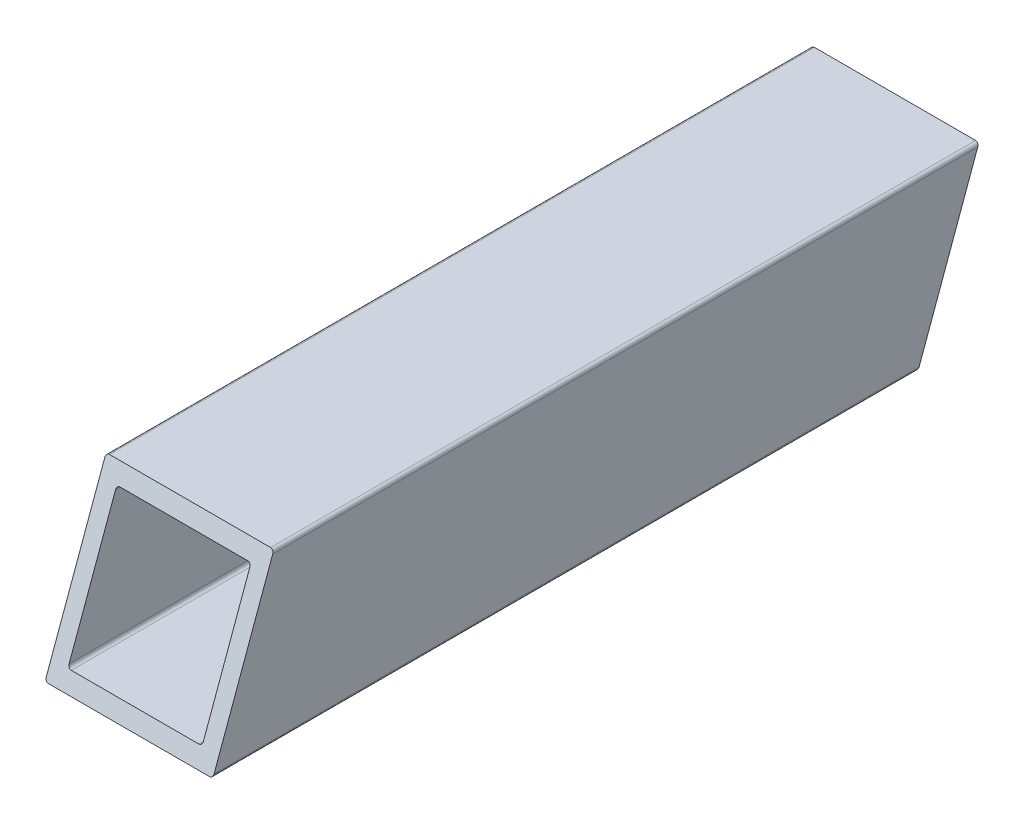
ISO-10303-21;
HEADER;
FILE_DESCRIPTION(('STEP AP214'),'2;1');
FILE_NAME('part.step','',(''),(''),'','','');
FILE_SCHEMA(('AUTOMOTIVE_DESIGN { 1 0 10303 214 1 1 1 1 }'));
ENDSEC;
DATA;
#1=APPLICATION_CONTEXT('core data for automotive mechanical design processes');
#2=APPLICATION_PROTOCOL_DEFINITION('international standard','automotive_design',2000,#1);
#3=PRODUCT_CONTEXT('',#1,'mechanical');
#4=PRODUCT('Part','Part','',(#3));
#5=PRODUCT_RELATED_PRODUCT_CATEGORY('part','',(#4));
#6=PRODUCT_DEFINITION_FORMATION('','',#4);
#7=PRODUCT_DEFINITION_CONTEXT('part definition',#1,'design');
#8=PRODUCT_DEFINITION('design','',#6,#7);
#9=PRODUCT_DEFINITION_SHAPE('','',#8);
#10=(LENGTH_UNIT() NAMED_UNIT(*) SI_UNIT(.MILLI.,.METRE.));
#11=(NAMED_UNIT(*) PLANE_ANGLE_UNIT() SI_UNIT($,.RADIAN.));
#12=(NAMED_UNIT(*) SI_UNIT($,.STERADIAN.) SOLID_ANGLE_UNIT());
#13=UNCERTAINTY_MEASURE_WITH_UNIT(LENGTH_MEASURE(1.E-05),#10,'distance_accuracy_value','');
#14=(GEOMETRIC_REPRESENTATION_CONTEXT(3) GLOBAL_UNCERTAINTY_ASSIGNED_CONTEXT((#13)) GLOBAL_UNIT_ASSIGNED_CONTEXT((#10,
#11,#12)) REPRESENTATION_CONTEXT('',''));
#15=CARTESIAN_POINT('',(0.,0.,0.));
#16=DIRECTION('',(0.,0.,1.));
#17=DIRECTION('',(1.,0.,0.));
#18=AXIS2_PLACEMENT_3D('',#15,#16,#17);
#19=CARTESIAN_POINT('',(-5.,5.,200.));
#20=DIRECTION('',(1.,0.,0.));
#21=DIRECTION('',(0.,1.,0.));
#22=AXIS2_PLACEMENT_3D('',#19,#20,#21);
#23=PLANE('',#22);
#24=DIRECTION('',(0.,0.,-1.));
#25=VECTOR('',#24,1.);
#26=CARTESIAN_POINT('',(-5.,-4.8,200.));
#27=LINE('',#26,#25);
#28=CARTESIAN_POINT('',(-5.,-4.8,3.56690829580883));
#29=VERTEX_POINT('',#28);
#30=CARTESIAN_POINT('',(-5.,-4.8,45.5669082958088));
#31=VERTEX_POINT('',#30);
#32=EDGE_CURVE('E275',#29,#31,#27,.F.);
#33=ORIENTED_EDGE('',*,*,#32,.T.);
#34=DIRECTION('',(0.,0.939692620785909,-0.342020143325668));
#35=VECTOR('',#34,1.);
#36=CARTESIAN_POINT('',(-5.,-5.,45.6397023426621));
#37=LINE('',#36,#35);
#38=CARTESIAN_POINT('',(-5.,4.8,42.0727940468533));
#39=VERTEX_POINT('',#38);
#40=EDGE_CURVE('E163',#31,#39,#37,.T.);
#41=ORIENTED_EDGE('',*,*,#40,.T.);
#42=DIRECTION('',(0.,0.,-1.));
#43=VECTOR('',#42,1.);
#44=CARTESIAN_POINT('',(-5.,4.8,200.));
#45=LINE('',#44,#43);
#46=CARTESIAN_POINT('',(-5.,4.8,0.0727940468532356));
#47=VERTEX_POINT('',#46);
#48=EDGE_CURVE('E273',#39,#47,#45,.T.);
#49=ORIENTED_EDGE('',*,*,#48,.T.);
#50=DIRECTION('',(0.,-0.939692620785907,0.342020143325673));
#51=VECTOR('',#50,1.);
#52=CARTESIAN_POINT('',(-5.,-5.,3.63970234266207));
#53=LINE('',#52,#51);
#54=EDGE_CURVE('E187',#47,#29,#53,.T.);
#55=ORIENTED_EDGE('',*,*,#54,.T.);
#56=EDGE_LOOP('',(#33,#41,#49,#55));
#57=FACE_BOUND('',#56,.T.);
#58=ADVANCED_FACE('F34',(#57),#23,.F.);
#59=CARTESIAN_POINT('',(-5.,-5.,200.));
#60=DIRECTION('',(0.,1.,0.));
#61=DIRECTION('',(-1.,0.,0.));
#62=AXIS2_PLACEMENT_3D('',#59,#60,#61);
#63=PLANE('',#62);
#64=DIRECTION('',(0.,0.,-1.));
#65=VECTOR('',#64,1.);
#66=CARTESIAN_POINT('',(4.8,-5.,200.));
#67=LINE('',#66,#65);
#68=CARTESIAN_POINT('',(4.8,-5.,3.63970234266207));
#69=VERTEX_POINT('',#68);
#70=CARTESIAN_POINT('',(4.8,-5.,45.6397023426621));
#71=VERTEX_POINT('',#70);
#72=EDGE_CURVE('E269',#69,#71,#67,.F.);
#73=ORIENTED_EDGE('',*,*,#72,.T.);
#74=DIRECTION('',(1.,0.,0.));
#75=VECTOR('',#74,1.);
#76=CARTESIAN_POINT('',(-5.,-5.,45.6397023426621));
#77=LINE('',#76,#75);
#78=CARTESIAN_POINT('',(-4.8,-5.,45.6397023426621));
#79=VERTEX_POINT('',#78);
#80=EDGE_CURVE('E147',#79,#71,#77,.T.);
#81=ORIENTED_EDGE('',*,*,#80,.F.);
#82=DIRECTION('',(0.,0.,-1.));
#83=VECTOR('',#82,1.);
#84=CARTESIAN_POINT('',(-4.8,-5.,200.));
#85=LINE('',#84,#83);
#86=CARTESIAN_POINT('',(-4.8,-5.,3.63970234266207));
#87=VERTEX_POINT('',#86);
#88=EDGE_CURVE('E271',#79,#87,#85,.T.);
#89=ORIENTED_EDGE('',*,*,#88,.T.);
#90=DIRECTION('',(1.,0.,0.));
#91=VECTOR('',#90,1.);
#92=CARTESIAN_POINT('',(-5.,-5.,3.63970234266207));
#93=LINE('',#92,#91);
#94=EDGE_CURVE('E220',#87,#69,#93,.T.);
#95=ORIENTED_EDGE('',*,*,#94,.T.);
#96=EDGE_LOOP('',(#73,#81,#89,#95));
#97=FACE_BOUND('',#96,.T.);
#98=ADVANCED_FACE('F318',(#97),#63,.F.);
#99=CARTESIAN_POINT('',(5.,5.,200.));
#100=DIRECTION('',(-1.,0.,0.));
#101=DIRECTION('',(0.,-1.,0.));
#102=AXIS2_PLACEMENT_3D('',#99,#100,#101);
#103=PLANE('',#102);
#104=DIRECTION('',(0.,0.,-1.));
#105=VECTOR('',#104,1.);
#106=CARTESIAN_POINT('',(5.,4.8,200.));
#107=LINE('',#106,#105);
#108=CARTESIAN_POINT('',(5.,4.8,0.0727940468532356));
#109=VERTEX_POINT('',#108);
#110=CARTESIAN_POINT('',(5.,4.8,42.0727940468533));
#111=VERTEX_POINT('',#110);
#112=EDGE_CURVE('E162',#109,#111,#107,.F.);
#113=ORIENTED_EDGE('',*,*,#112,.T.);
#114=DIRECTION('',(0.,0.939692620785909,-0.342020143325668));
#115=VECTOR('',#114,1.);
#116=CARTESIAN_POINT('',(5.,-5.,45.6397023426621));
#117=LINE('',#116,#115);
#118=CARTESIAN_POINT('',(5.,-4.8,45.5669082958088));
#119=VERTEX_POINT('',#118);
#120=EDGE_CURVE('E56',#119,#111,#117,.T.);
#121=ORIENTED_EDGE('',*,*,#120,.F.);
#122=DIRECTION('',(0.,0.,-1.));
#123=VECTOR('',#122,1.);
#124=CARTESIAN_POINT('',(5.,-4.8,200.));
#125=LINE('',#124,#123);
#126=CARTESIAN_POINT('',(5.,-4.8,3.56690829580883));
#127=VERTEX_POINT('',#126);
#128=EDGE_CURVE('E159',#119,#127,#125,.T.);
#129=ORIENTED_EDGE('',*,*,#128,.T.);
#130=DIRECTION('',(0.,-0.939692620785907,0.342020143325673));
#131=VECTOR('',#130,1.);
#132=CARTESIAN_POINT('',(5.,-5.,3.63970234266207));
#133=LINE('',#132,#131);
#134=EDGE_CURVE('E182',#109,#127,#133,.T.);
#135=ORIENTED_EDGE('',*,*,#134,.F.);
#136=EDGE_LOOP('',(#113,#121,#129,#135));
#137=FACE_BOUND('',#136,.T.);
#138=ADVANCED_FACE('F157',(#137),#103,.F.);
#139=CARTESIAN_POINT('',(-5.,5.,200.));
#140=DIRECTION('',(0.,-1.,0.));
#141=DIRECTION('',(1.,0.,0.));
#142=AXIS2_PLACEMENT_3D('',#139,#140,#141);
#143=PLANE('',#142);
#144=DIRECTION('',(0.,0.,-1.));
#145=VECTOR('',#144,1.);
#146=CARTESIAN_POINT('',(-4.8,5.,200.));
#147=LINE('',#146,#145);
#148=CARTESIAN_POINT('',(-4.8,5.,0.));
#149=VERTEX_POINT('',#148);
#150=CARTESIAN_POINT('',(-4.8,5.,42.0000000000001));
#151=VERTEX_POINT('',#150);
#152=EDGE_CURVE('E170',#149,#151,#147,.F.);
#153=ORIENTED_EDGE('',*,*,#152,.T.);
#154=DIRECTION('',(1.,0.,0.));
#155=VECTOR('',#154,1.);
#156=CARTESIAN_POINT('',(-5.,5.,42.0000000000001));
#157=LINE('',#156,#155);
#158=CARTESIAN_POINT('',(4.8,5.,42.0000000000001));
#159=VERTEX_POINT('',#158);
#160=EDGE_CURVE('E190',#151,#159,#157,.T.);
#161=ORIENTED_EDGE('',*,*,#160,.T.);
#162=DIRECTION('',(0.,0.,-1.));
#163=VECTOR('',#162,1.);
#164=CARTESIAN_POINT('',(4.8,5.,200.));
#165=LINE('',#164,#163);
#166=CARTESIAN_POINT('',(4.8,5.,0.));
#167=VERTEX_POINT('',#166);
#168=EDGE_CURVE('E168',#159,#167,#165,.T.);
#169=ORIENTED_EDGE('',*,*,#168,.T.);
#170=DIRECTION('',(-1.,0.,0.));
#171=VECTOR('',#170,1.);
#172=CARTESIAN_POINT('',(-5.,5.,0.));
#173=LINE('',#172,#171);
#174=EDGE_CURVE('E184',#167,#149,#173,.T.);
#175=ORIENTED_EDGE('',*,*,#174,.T.);
#176=EDGE_LOOP('',(#153,#161,#169,#175));
#177=FACE_BOUND('',#176,.T.);
#178=ADVANCED_FACE('F193',(#177),#143,.F.);
#179=CARTESIAN_POINT('',(-4.,4.,200.));
#180=DIRECTION('',(1.,0.,0.));
#181=DIRECTION('',(0.,1.,0.));
#182=AXIS2_PLACEMENT_3D('',#179,#180,#181);
#183=PLANE('',#182);
#184=DIRECTION('',(0.,0.939692620785909,-0.342020143325668));
#185=VECTOR('',#184,1.);
#186=CARTESIAN_POINT('',(-3.99999999999999,-46.6632433867959,60.803882798444));
#187=LINE('',#186,#185);
#188=CARTESIAN_POINT('',(-4.,-3.8,45.2029380615426));
#189=VERTEX_POINT('',#188);
#190=CARTESIAN_POINT('',(-4.,3.8,42.4367642811195));
#191=VERTEX_POINT('',#190);
#192=EDGE_CURVE('E202',#189,#191,#187,.T.);
#193=ORIENTED_EDGE('',*,*,#192,.F.);
#194=DIRECTION('',(0.,0.,-1.));
#195=VECTOR('',#194,1.);
#196=CARTESIAN_POINT('',(-4.,-3.8,0.));
#197=LINE('',#196,#195);
#198=CARTESIAN_POINT('',(-4.,-3.8,3.20293806154262));
#199=VERTEX_POINT('',#198);
#200=EDGE_CURVE('E264',#189,#199,#197,.T.);
#201=ORIENTED_EDGE('',*,*,#200,.T.);
#202=DIRECTION('',(0.,-0.939692620785907,0.342020143325673));
#203=VECTOR('',#202,1.);
#204=CARTESIAN_POINT('',(-3.99999999999999,-60.1617831902141,23.716949492946));
#205=LINE('',#204,#203);
#206=CARTESIAN_POINT('',(-4.,3.8,0.436764281119412));
#207=VERTEX_POINT('',#206);
#208=EDGE_CURVE('E230',#207,#199,#205,.T.);
#209=ORIENTED_EDGE('',*,*,#208,.F.);
#210=DIRECTION('',(0.,0.,-1.));
#211=VECTOR('',#210,1.);
#212=CARTESIAN_POINT('',(-4.,3.8,200.));
#213=LINE('',#212,#211);
#214=EDGE_CURVE('E266',#207,#191,#213,.F.);
#215=ORIENTED_EDGE('',*,*,#214,.T.);
#216=EDGE_LOOP('',(#193,#201,#209,#215));
#217=FACE_BOUND('',#216,.T.);
#218=ADVANCED_FACE('F307',(#217),#183,.T.);
#219=CARTESIAN_POINT('',(-4.,-4.,200.));
#220=DIRECTION('',(0.,1.,0.));
#221=DIRECTION('',(0.,0.,1.));
#222=AXIS2_PLACEMENT_3D('',#219,#220,#221);
#223=PLANE('',#222);
#224=DIRECTION('',(-1.,0.,0.));
#225=VECTOR('',#224,1.);
#226=CARTESIAN_POINT('',(-3.99999999999999,-4.,45.2757321083959));
#227=LINE('',#226,#225);
#228=CARTESIAN_POINT('',(3.8,-4.,45.2757321083959));
#229=VERTEX_POINT('',#228);
#230=CARTESIAN_POINT('',(-3.8,-4.,45.2757321083959));
#231=VERTEX_POINT('',#230);
#232=EDGE_CURVE('E49',#229,#231,#227,.T.);
#233=ORIENTED_EDGE('',*,*,#232,.F.);
#234=DIRECTION('',(0.,0.,-1.));
#235=VECTOR('',#234,1.);
#236=CARTESIAN_POINT('',(3.8,-4.,0.));
#237=LINE('',#236,#235);
#238=CARTESIAN_POINT('',(3.8,-4.,3.27573210839585));
#239=VERTEX_POINT('',#238);
#240=EDGE_CURVE('E172',#229,#239,#237,.T.);
#241=ORIENTED_EDGE('',*,*,#240,.T.);
#242=DIRECTION('',(1.,0.,0.));
#243=VECTOR('',#242,1.);
#244=CARTESIAN_POINT('',(-3.99999999999999,-4.,3.27573210839585));
#245=LINE('',#244,#243);
#246=CARTESIAN_POINT('',(-3.8,-4.,3.27573210839588));
#247=VERTEX_POINT('',#246);
#248=EDGE_CURVE('E227',#247,#239,#245,.T.);
#249=ORIENTED_EDGE('',*,*,#248,.F.);
#250=DIRECTION('',(0.,0.,-1.));
#251=VECTOR('',#250,1.);
#252=CARTESIAN_POINT('',(-3.8,-4.,200.));
#253=LINE('',#252,#251);
#254=EDGE_CURVE('E278',#247,#231,#253,.F.);
#255=ORIENTED_EDGE('',*,*,#254,.T.);
#256=EDGE_LOOP('',(#233,#241,#249,#255));
#257=FACE_BOUND('',#256,.T.);
#258=ADVANCED_FACE('F283',(#257),#223,.T.);
#259=CARTESIAN_POINT('',(4.,4.,200.));
#260=DIRECTION('',(-1.,0.,0.));
#261=DIRECTION('',(0.,-1.,0.));
#262=AXIS2_PLACEMENT_3D('',#259,#260,#261);
#263=PLANE('',#262);
#264=DIRECTION('',(0.,-0.939692620785909,0.342020143325668));
#265=VECTOR('',#264,1.);
#266=CARTESIAN_POINT('',(4.00000000000002,-46.6632433867959,60.803882798444));
#267=LINE('',#266,#265);
#268=CARTESIAN_POINT('',(4.,3.8,42.4367642811195));
#269=VERTEX_POINT('',#268);
#270=CARTESIAN_POINT('',(4.,-3.8,45.2029380615426));
#271=VERTEX_POINT('',#270);
#272=EDGE_CURVE('E212',#269,#271,#267,.T.);
#273=ORIENTED_EDGE('',*,*,#272,.F.);
#274=DIRECTION('',(0.,0.,-1.));
#275=VECTOR('',#274,1.);
#276=CARTESIAN_POINT('',(4.,3.8,0.));
#277=LINE('',#276,#275);
#278=CARTESIAN_POINT('',(4.,3.8,0.436764281119412));
#279=VERTEX_POINT('',#278);
#280=EDGE_CURVE('E257',#269,#279,#277,.T.);
#281=ORIENTED_EDGE('',*,*,#280,.T.);
#282=DIRECTION('',(0.,0.939692620785907,-0.342020143325673));
#283=VECTOR('',#282,1.);
#284=CARTESIAN_POINT('',(4.00000000000002,-60.1617831902141,23.716949492946));
#285=LINE('',#284,#283);
#286=CARTESIAN_POINT('',(4.,-3.8,3.20293806154262));
#287=VERTEX_POINT('',#286);
#288=EDGE_CURVE('E242',#287,#279,#285,.T.);
#289=ORIENTED_EDGE('',*,*,#288,.F.);
#290=DIRECTION('',(0.,0.,-1.));
#291=VECTOR('',#290,1.);
#292=CARTESIAN_POINT('',(4.,-3.8,200.));
#293=LINE('',#292,#291);
#294=EDGE_CURVE('E254',#287,#271,#293,.F.);
#295=ORIENTED_EDGE('',*,*,#294,.T.);
#296=EDGE_LOOP('',(#273,#281,#289,#295));
#297=FACE_BOUND('',#296,.T.);
#298=ADVANCED_FACE('F291',(#297),#263,.T.);
#299=CARTESIAN_POINT('',(-4.,4.,200.));
#300=DIRECTION('',(0.,-1.,0.));
#301=DIRECTION('',(0.,0.,-1.));
#302=AXIS2_PLACEMENT_3D('',#299,#300,#301);
#303=PLANE('',#302);
#304=DIRECTION('',(1.,0.,0.));
#305=VECTOR('',#304,1.);
#306=CARTESIAN_POINT('',(-3.99999999999999,4.,42.3639702342662));
#307=LINE('',#306,#305);
#308=CARTESIAN_POINT('',(-3.8,4.,42.3639702342662));
#309=VERTEX_POINT('',#308);
#310=CARTESIAN_POINT('',(3.8,4.,42.3639702342662));
#311=VERTEX_POINT('',#310);
#312=EDGE_CURVE('E210',#309,#311,#307,.T.);
#313=ORIENTED_EDGE('',*,*,#312,.F.);
#314=DIRECTION('',(0.,0.,-1.));
#315=VECTOR('',#314,1.);
#316=CARTESIAN_POINT('',(-3.8,4.,0.));
#317=LINE('',#316,#315);
#318=CARTESIAN_POINT('',(-3.8,4.,0.363970234266198));
#319=VERTEX_POINT('',#318);
#320=EDGE_CURVE('E259',#309,#319,#317,.T.);
#321=ORIENTED_EDGE('',*,*,#320,.T.);
#322=DIRECTION('',(-1.,0.,0.));
#323=VECTOR('',#322,1.);
#324=CARTESIAN_POINT('',(-3.99999999999999,4.,0.363970234266181));
#325=LINE('',#324,#323);
#326=CARTESIAN_POINT('',(3.8,4.,0.363970234266182));
#327=VERTEX_POINT('',#326);
#328=EDGE_CURVE('E239',#327,#319,#325,.T.);
#329=ORIENTED_EDGE('',*,*,#328,.F.);
#330=DIRECTION('',(0.,0.,-1.));
#331=VECTOR('',#330,1.);
#332=CARTESIAN_POINT('',(3.8,4.,200.));
#333=LINE('',#332,#331);
#334=EDGE_CURVE('E261',#327,#311,#333,.F.);
#335=ORIENTED_EDGE('',*,*,#334,.T.);
#336=EDGE_LOOP('',(#313,#321,#329,#335));
#337=FACE_BOUND('',#336,.T.);
#338=ADVANCED_FACE('F299',(#337),#303,.T.);
#339=CARTESIAN_POINT('',(3.8,3.8,200.));
#340=DIRECTION('',(0.,0.,1.));
#341=DIRECTION('',(1.,0.,0.));
#342=AXIS2_PLACEMENT_3D('',#339,#340,#341);
#343=CYLINDRICAL_SURFACE('',#342,0.2);
#344=ORIENTED_EDGE('',*,*,#280,.F.);
#345=CARTESIAN_POINT('',(3.8,3.8,42.4367642811195));
#346=DIRECTION('',(0.,-0.342020143325668,-0.939692620785909));
#347=DIRECTION('',(0.,-0.939692620785909,0.342020143325668));
#348=AXIS2_PLACEMENT_3D('',#345,#346,#347);
#349=ELLIPSE('',#348,0.212835554495182,0.2);
#350=EDGE_CURVE('E214',#269,#311,#349,.F.);
#351=ORIENTED_EDGE('',*,*,#350,.T.);
#352=ORIENTED_EDGE('',*,*,#334,.F.);
#353=CARTESIAN_POINT('',(3.8,3.8,0.436764281119439));
#354=DIRECTION('',(0.,0.342020143325673,0.939692620785907));
#355=DIRECTION('',(0.,-0.939692620785907,0.342020143325673));
#356=AXIS2_PLACEMENT_3D('',#353,#354,#355);
#357=ELLIPSE('',#356,0.212835554495183,0.2);
#358=EDGE_CURVE('E245',#327,#279,#357,.F.);
#359=ORIENTED_EDGE('',*,*,#358,.T.);
#360=EDGE_LOOP('',(#344,#351,#352,#359));
#361=FACE_BOUND('',#360,.T.);
#362=ADVANCED_FACE('F296',(#361),#343,.F.);
#363=CARTESIAN_POINT('',(-3.8,3.8,200.));
#364=DIRECTION('',(0.,0.,1.));
#365=DIRECTION('',(1.,0.,0.));
#366=AXIS2_PLACEMENT_3D('',#363,#364,#365);
#367=CYLINDRICAL_SURFACE('',#366,0.2);
#368=ORIENTED_EDGE('',*,*,#320,.F.);
#369=CARTESIAN_POINT('',(-3.8,3.8,42.4367642811195));
#370=DIRECTION('',(0.,-0.342020143325668,-0.939692620785909));
#371=DIRECTION('',(0.,-0.939692620785909,0.342020143325668));
#372=AXIS2_PLACEMENT_3D('',#369,#370,#371);
#373=ELLIPSE('',#372,0.212835554495182,0.2);
#374=EDGE_CURVE('E207',#309,#191,#373,.F.);
#375=ORIENTED_EDGE('',*,*,#374,.T.);
#376=ORIENTED_EDGE('',*,*,#214,.F.);
#377=CARTESIAN_POINT('',(-3.8,3.8,0.436764281119439));
#378=DIRECTION('',(0.,0.342020143325673,0.939692620785907));
#379=DIRECTION('',(0.,-0.939692620785907,0.342020143325673));
#380=AXIS2_PLACEMENT_3D('',#377,#378,#379);
#381=ELLIPSE('',#380,0.212835554495183,0.2);
#382=EDGE_CURVE('E236',#207,#319,#381,.F.);
#383=ORIENTED_EDGE('',*,*,#382,.T.);
#384=EDGE_LOOP('',(#368,#375,#376,#383));
#385=FACE_BOUND('',#384,.T.);
#386=ADVANCED_FACE('F304',(#385),#367,.F.);
#387=CARTESIAN_POINT('',(-4.8,-4.8,200.));
#388=DIRECTION('',(0.,0.,-1.));
#389=DIRECTION('',(-1.,0.,0.));
#390=AXIS2_PLACEMENT_3D('',#387,#388,#389);
#391=CYLINDRICAL_SURFACE('',#390,0.2);
#392=CARTESIAN_POINT('',(-4.8,-4.8,45.5669082958088));
#393=DIRECTION('',(0.,-0.342020143325668,-0.939692620785909));
#394=DIRECTION('',(0.,0.939692620785909,-0.342020143325668));
#395=AXIS2_PLACEMENT_3D('',#392,#393,#394);
#396=ELLIPSE('',#395,0.212835554495182,0.2);
#397=EDGE_CURVE('E152',#31,#79,#396,.F.);
#398=ORIENTED_EDGE('',*,*,#397,.F.);
#399=ORIENTED_EDGE('',*,*,#32,.F.);
#400=CARTESIAN_POINT('',(-4.8,-4.8,3.5669082958088));
#401=DIRECTION('',(0.,0.342020143325673,0.939692620785907));
#402=DIRECTION('',(0.,0.939692620785907,-0.342020143325673));
#403=AXIS2_PLACEMENT_3D('',#400,#401,#402);
#404=ELLIPSE('',#403,0.212835554495183,0.2);
#405=EDGE_CURVE('E251',#87,#29,#404,.F.);
#406=ORIENTED_EDGE('',*,*,#405,.F.);
#407=ORIENTED_EDGE('',*,*,#88,.F.);
#408=EDGE_LOOP('',(#398,#399,#406,#407));
#409=FACE_BOUND('',#408,.T.);
#410=ADVANCED_FACE('F332',(#409),#391,.T.);
#411=CARTESIAN_POINT('',(3.8,-3.8,200.));
#412=DIRECTION('',(0.,0.,1.));
#413=DIRECTION('',(1.,0.,0.));
#414=AXIS2_PLACEMENT_3D('',#411,#412,#413);
#415=CYLINDRICAL_SURFACE('',#414,0.2);
#416=ORIENTED_EDGE('',*,*,#240,.F.);
#417=CARTESIAN_POINT('',(3.8,-3.8,45.2029380615426));
#418=DIRECTION('',(0.,-0.342020143325668,-0.939692620785909));
#419=DIRECTION('',(0.,-0.939692620785909,0.342020143325668));
#420=AXIS2_PLACEMENT_3D('',#417,#418,#419);
#421=ELLIPSE('',#420,0.212835554495182,0.2);
#422=EDGE_CURVE('E204',#229,#271,#421,.F.);
#423=ORIENTED_EDGE('',*,*,#422,.T.);
#424=ORIENTED_EDGE('',*,*,#294,.F.);
#425=CARTESIAN_POINT('',(3.8,-3.8,3.20293806154262));
#426=DIRECTION('',(0.,0.342020143325673,0.939692620785907));
#427=DIRECTION('',(0.,-0.939692620785907,0.342020143325673));
#428=AXIS2_PLACEMENT_3D('',#425,#426,#427);
#429=ELLIPSE('',#428,0.212835554495183,0.2);
#430=EDGE_CURVE('E233',#287,#239,#429,.F.);
#431=ORIENTED_EDGE('',*,*,#430,.T.);
#432=EDGE_LOOP('',(#416,#423,#424,#431));
#433=FACE_BOUND('',#432,.T.);
#434=ADVANCED_FACE('F288',(#433),#415,.F.);
#435=CARTESIAN_POINT('',(4.8,-4.8,200.));
#436=DIRECTION('',(0.,0.,-1.));
#437=DIRECTION('',(-1.,0.,0.));
#438=AXIS2_PLACEMENT_3D('',#435,#436,#437);
#439=CYLINDRICAL_SURFACE('',#438,0.2);
#440=CARTESIAN_POINT('',(4.8,-4.8,45.5669082958088));
#441=DIRECTION('',(0.,-0.342020143325668,-0.939692620785909));
#442=DIRECTION('',(0.,0.939692620785909,-0.342020143325668));
#443=AXIS2_PLACEMENT_3D('',#440,#441,#442);
#444=ELLIPSE('',#443,0.212835554495182,0.2);
#445=EDGE_CURVE('E144',#71,#119,#444,.F.);
#446=ORIENTED_EDGE('',*,*,#445,.F.);
#447=ORIENTED_EDGE('',*,*,#72,.F.);
#448=CARTESIAN_POINT('',(4.8,-4.8,3.5669082958088));
#449=DIRECTION('',(0.,0.342020143325673,0.939692620785907));
#450=DIRECTION('',(0.,0.939692620785907,-0.342020143325673));
#451=AXIS2_PLACEMENT_3D('',#448,#449,#450);
#452=ELLIPSE('',#451,0.212835554495183,0.2);
#453=EDGE_CURVE('E167',#127,#69,#452,.F.);
#454=ORIENTED_EDGE('',*,*,#453,.F.);
#455=ORIENTED_EDGE('',*,*,#128,.F.);
#456=EDGE_LOOP('',(#446,#447,#454,#455));
#457=FACE_BOUND('',#456,.T.);
#458=ADVANCED_FACE('F166',(#457),#439,.T.);
#459=CARTESIAN_POINT('',(-4.8,4.8,200.));
#460=DIRECTION('',(0.,0.,-1.));
#461=DIRECTION('',(-1.,0.,0.));
#462=AXIS2_PLACEMENT_3D('',#459,#460,#461);
#463=CYLINDRICAL_SURFACE('',#462,0.2);
#464=CARTESIAN_POINT('',(-4.8,4.8,42.0727940468533));
#465=DIRECTION('',(0.,-0.342020143325668,-0.939692620785909));
#466=DIRECTION('',(0.,0.939692620785909,-0.342020143325668));
#467=AXIS2_PLACEMENT_3D('',#464,#465,#466);
#468=ELLIPSE('',#467,0.212835554495182,0.2);
#469=EDGE_CURVE('E153',#151,#39,#468,.F.);
#470=ORIENTED_EDGE('',*,*,#469,.F.);
#471=ORIENTED_EDGE('',*,*,#152,.F.);
#472=CARTESIAN_POINT('',(-4.8,4.8,0.0727940468532307));
#473=DIRECTION('',(0.,0.342020143325673,0.939692620785907));
#474=DIRECTION('',(0.,0.939692620785907,-0.342020143325673));
#475=AXIS2_PLACEMENT_3D('',#472,#473,#474);
#476=ELLIPSE('',#475,0.212835554495183,0.2);
#477=EDGE_CURVE('E248',#47,#149,#476,.F.);
#478=ORIENTED_EDGE('',*,*,#477,.F.);
#479=ORIENTED_EDGE('',*,*,#48,.F.);
#480=EDGE_LOOP('',(#470,#471,#478,#479));
#481=FACE_BOUND('',#480,.T.);
#482=ADVANCED_FACE('F340',(#481),#463,.T.);
#483=CARTESIAN_POINT('',(-3.8,-3.8,200.));
#484=DIRECTION('',(0.,0.,1.));
#485=DIRECTION('',(1.,0.,0.));
#486=AXIS2_PLACEMENT_3D('',#483,#484,#485);
#487=CYLINDRICAL_SURFACE('',#486,0.2);
#488=ORIENTED_EDGE('',*,*,#200,.F.);
#489=CARTESIAN_POINT('',(-3.8,-3.8,45.2029380615426));
#490=DIRECTION('',(0.,-0.342020143325668,-0.939692620785909));
#491=DIRECTION('',(0.,-0.939692620785909,0.342020143325668));
#492=AXIS2_PLACEMENT_3D('',#489,#490,#491);
#493=ELLIPSE('',#492,0.212835554495182,0.2);
#494=EDGE_CURVE('E195',#189,#231,#493,.F.);
#495=ORIENTED_EDGE('',*,*,#494,.T.);
#496=ORIENTED_EDGE('',*,*,#254,.F.);
#497=CARTESIAN_POINT('',(-3.8,-3.8,3.20293806154262));
#498=DIRECTION('',(0.,0.342020143325673,0.939692620785907));
#499=DIRECTION('',(0.,-0.939692620785907,0.342020143325673));
#500=AXIS2_PLACEMENT_3D('',#497,#498,#499);
#501=ELLIPSE('',#500,0.212835554495183,0.2);
#502=EDGE_CURVE('E224',#247,#199,#501,.F.);
#503=ORIENTED_EDGE('',*,*,#502,.T.);
#504=EDGE_LOOP('',(#488,#495,#496,#503));
#505=FACE_BOUND('',#504,.T.);
#506=ADVANCED_FACE('F310',(#505),#487,.F.);
#507=CARTESIAN_POINT('',(4.8,4.8,200.));
#508=DIRECTION('',(0.,0.,-1.));
#509=DIRECTION('',(-1.,0.,0.));
#510=AXIS2_PLACEMENT_3D('',#507,#508,#509);
#511=CYLINDRICAL_SURFACE('',#510,0.2);
#512=CARTESIAN_POINT('',(4.8,4.8,42.0727940468533));
#513=DIRECTION('',(0.,-0.342020143325668,-0.939692620785909));
#514=DIRECTION('',(0.,0.939692620785909,-0.342020143325668));
#515=AXIS2_PLACEMENT_3D('',#512,#513,#514);
#516=ELLIPSE('',#515,0.212835554495182,0.2);
#517=EDGE_CURVE('E11',#111,#159,#516,.F.);
#518=ORIENTED_EDGE('',*,*,#517,.F.);
#519=ORIENTED_EDGE('',*,*,#112,.F.);
#520=CARTESIAN_POINT('',(4.8,4.8,0.0727940468532307));
#521=DIRECTION('',(0.,0.342020143325673,0.939692620785907));
#522=DIRECTION('',(0.,0.939692620785907,-0.342020143325673));
#523=AXIS2_PLACEMENT_3D('',#520,#521,#522);
#524=ELLIPSE('',#523,0.212835554495183,0.2);
#525=EDGE_CURVE('E42',#167,#109,#524,.F.);
#526=ORIENTED_EDGE('',*,*,#525,.F.);
#527=ORIENTED_EDGE('',*,*,#168,.F.);
#528=EDGE_LOOP('',(#518,#519,#526,#527));
#529=FACE_BOUND('',#528,.T.);
#530=ADVANCED_FACE('F36',(#529),#511,.T.);
#531=CARTESIAN_POINT('',(-5.,-5.,3.63970234266207));
#532=DIRECTION('',(0.,0.342020143325673,0.939692620785907));
#533=DIRECTION('',(0.,-0.939692620785907,0.342020143325673));
#534=AXIS2_PLACEMENT_3D('',#531,#532,#533);
#535=PLANE('',#534);
#536=ORIENTED_EDGE('',*,*,#405,.T.);
#537=ORIENTED_EDGE('',*,*,#54,.F.);
#538=ORIENTED_EDGE('',*,*,#477,.T.);
#539=ORIENTED_EDGE('',*,*,#174,.F.);
#540=ORIENTED_EDGE('',*,*,#525,.T.);
#541=ORIENTED_EDGE('',*,*,#134,.T.);
#542=ORIENTED_EDGE('',*,*,#453,.T.);
#543=ORIENTED_EDGE('',*,*,#94,.F.);
#544=EDGE_LOOP('',(#536,#537,#538,#539,#540,#541,#542,#543));
#545=FACE_BOUND('',#544,.T.);
#546=ORIENTED_EDGE('',*,*,#328,.T.);
#547=ORIENTED_EDGE('',*,*,#382,.F.);
#548=ORIENTED_EDGE('',*,*,#208,.T.);
#549=ORIENTED_EDGE('',*,*,#502,.F.);
#550=ORIENTED_EDGE('',*,*,#248,.T.);
#551=ORIENTED_EDGE('',*,*,#430,.F.);
#552=ORIENTED_EDGE('',*,*,#288,.T.);
#553=ORIENTED_EDGE('',*,*,#358,.F.);
#554=EDGE_LOOP('',(#546,#547,#548,#549,#550,#551,#552,#553));
#555=FACE_BOUND('',#554,.T.);
#556=ADVANCED_FACE('F180',(#545,#555),#535,.F.);
#557=CARTESIAN_POINT('',(-5.,-5.,45.6397023426621));
#558=DIRECTION('',(0.,-0.342020143325668,-0.939692620785909));
#559=DIRECTION('',(0.,0.939692620785909,-0.342020143325668));
#560=AXIS2_PLACEMENT_3D('',#557,#558,#559);
#561=PLANE('',#560);
#562=ORIENTED_EDGE('',*,*,#397,.T.);
#563=ORIENTED_EDGE('',*,*,#80,.T.);
#564=ORIENTED_EDGE('',*,*,#445,.T.);
#565=ORIENTED_EDGE('',*,*,#120,.T.);
#566=ORIENTED_EDGE('',*,*,#517,.T.);
#567=ORIENTED_EDGE('',*,*,#160,.F.);
#568=ORIENTED_EDGE('',*,*,#469,.T.);
#569=ORIENTED_EDGE('',*,*,#40,.F.);
#570=EDGE_LOOP('',(#562,#563,#564,#565,#566,#567,#568,#569));
#571=FACE_BOUND('',#570,.T.);
#572=ORIENTED_EDGE('',*,*,#272,.T.);
#573=ORIENTED_EDGE('',*,*,#422,.F.);
#574=ORIENTED_EDGE('',*,*,#232,.T.);
#575=ORIENTED_EDGE('',*,*,#494,.F.);
#576=ORIENTED_EDGE('',*,*,#192,.T.);
#577=ORIENTED_EDGE('',*,*,#374,.F.);
#578=ORIENTED_EDGE('',*,*,#312,.T.);
#579=ORIENTED_EDGE('',*,*,#350,.F.);
#580=EDGE_LOOP('',(#572,#573,#574,#575,#576,#577,#578,#579));
#581=FACE_BOUND('',#580,.T.);
#582=ADVANCED_FACE('F145',(#571,#581),#561,.F.);
#583=CLOSED_SHELL('',(#58,#98,#138,#178,#218,#258,#298,#338,#362,#386,#410,#434,#458,#482,#506,
#530,#556,#582));
#584=MANIFOLD_SOLID_BREP('B2',#583);
#585=ADVANCED_BREP_SHAPE_REPRESENTATION('',(#18,#584),#14);
#586=SHAPE_DEFINITION_REPRESENTATION(#9,#585);
ENDSEC;
END-ISO-10303-21;
